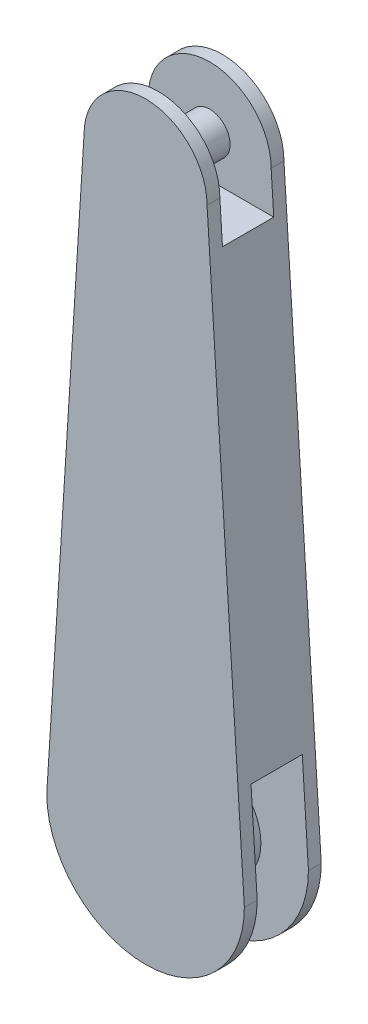
ISO-10303-21;
HEADER;
FILE_DESCRIPTION(('STEP AP214'),'2;1');
FILE_NAME('part.step','',(''),(''),'','','');
FILE_SCHEMA(('AUTOMOTIVE_DESIGN { 1 0 10303 214 1 1 1 1 }'));
ENDSEC;
DATA;
#1=APPLICATION_CONTEXT('core data for automotive mechanical design processes');
#2=APPLICATION_PROTOCOL_DEFINITION('international standard','automotive_design',2000,#1);
#3=PRODUCT_CONTEXT('',#1,'mechanical');
#4=PRODUCT('Part','Part','',(#3));
#5=PRODUCT_RELATED_PRODUCT_CATEGORY('part','',(#4));
#6=PRODUCT_DEFINITION_FORMATION('','',#4);
#7=PRODUCT_DEFINITION_CONTEXT('part definition',#1,'design');
#8=PRODUCT_DEFINITION('design','',#6,#7);
#9=PRODUCT_DEFINITION_SHAPE('','',#8);
#10=(LENGTH_UNIT() NAMED_UNIT(*) SI_UNIT(.MILLI.,.METRE.));
#11=(NAMED_UNIT(*) PLANE_ANGLE_UNIT() SI_UNIT($,.RADIAN.));
#12=(NAMED_UNIT(*) SI_UNIT($,.STERADIAN.) SOLID_ANGLE_UNIT());
#13=UNCERTAINTY_MEASURE_WITH_UNIT(LENGTH_MEASURE(1.E-05),#10,'distance_accuracy_value','');
#14=(GEOMETRIC_REPRESENTATION_CONTEXT(3) GLOBAL_UNCERTAINTY_ASSIGNED_CONTEXT((#13)) GLOBAL_UNIT_ASSIGNED_CONTEXT((#10,
#11,#12)) REPRESENTATION_CONTEXT('',''));
#15=CARTESIAN_POINT('',(0.,0.,0.));
#16=DIRECTION('',(0.,0.,1.));
#17=DIRECTION('',(1.,0.,0.));
#18=AXIS2_PLACEMENT_3D('',#15,#16,#17);
#19=CARTESIAN_POINT('',(0.,1342.75,75.));
#20=DIRECTION('',(0.,0.,-1.));
#21=DIRECTION('',(-1.,0.,0.));
#22=AXIS2_PLACEMENT_3D('',#19,#20,#21);
#23=CYLINDRICAL_SURFACE('',#22,120.);
#24=DIRECTION('',(0.,0.,-1.));
#25=VECTOR('',#24,1.);
#26=CARTESIAN_POINT('',(120.,1342.75,75.));
#27=LINE('',#26,#25);
#28=CARTESIAN_POINT('',(120.,1342.75,75.));
#29=VERTEX_POINT('',#28);
#30=CARTESIAN_POINT('',(120.,1342.75,50.));
#31=VERTEX_POINT('',#30);
#32=EDGE_CURVE('E191',#29,#31,#27,.T.);
#33=ORIENTED_EDGE('',*,*,#32,.T.);
#34=CARTESIAN_POINT('',(0.,1342.75,50.));
#35=DIRECTION('',(0.,0.,1.));
#36=DIRECTION('',(1.,0.,0.));
#37=AXIS2_PLACEMENT_3D('',#34,#35,#36);
#38=CIRCLE('',#37,120.);
#39=CARTESIAN_POINT('',(-120.,1342.75,50.));
#40=VERTEX_POINT('',#39);
#41=EDGE_CURVE('E59',#31,#40,#38,.T.);
#42=ORIENTED_EDGE('',*,*,#41,.T.);
#43=DIRECTION('',(0.,0.,-1.));
#44=VECTOR('',#43,1.);
#45=CARTESIAN_POINT('',(-120.,1342.75,75.));
#46=LINE('',#45,#44);
#47=CARTESIAN_POINT('',(-120.,1342.75,75.));
#48=VERTEX_POINT('',#47);
#49=EDGE_CURVE('E146',#48,#40,#46,.T.);
#50=ORIENTED_EDGE('',*,*,#49,.F.);
#51=CARTESIAN_POINT('',(0.,1342.75,75.));
#52=DIRECTION('',(0.,0.,1.));
#53=DIRECTION('',(1.,0.,0.));
#54=AXIS2_PLACEMENT_3D('',#51,#52,#53);
#55=CIRCLE('',#54,120.);
#56=EDGE_CURVE('E169',#29,#48,#55,.T.);
#57=ORIENTED_EDGE('',*,*,#56,.F.);
#58=EDGE_LOOP('',(#33,#42,#50,#57));
#59=FACE_BOUND('',#58,.T.);
#60=ADVANCED_FACE('F36',(#59),#23,.T.);
#61=CARTESIAN_POINT('',(0.,192.75,75.));
#62=DIRECTION('',(0.,0.,-1.));
#63=DIRECTION('',(-1.,0.,0.));
#64=AXIS2_PLACEMENT_3D('',#61,#62,#63);
#65=CYLINDRICAL_SURFACE('',#64,192.75);
#66=DIRECTION('',(0.,0.,-1.));
#67=VECTOR('',#66,1.);
#68=CARTESIAN_POINT('',(192.75,192.75,75.));
#69=LINE('',#68,#67);
#70=CARTESIAN_POINT('',(192.75,192.75,-50.));
#71=VERTEX_POINT('',#70);
#72=CARTESIAN_POINT('',(192.75,192.75,-75.));
#73=VERTEX_POINT('',#72);
#74=EDGE_CURVE('E194',#71,#73,#69,.T.);
#75=ORIENTED_EDGE('',*,*,#74,.F.);
#76=CARTESIAN_POINT('',(0.,192.75,-50.));
#77=DIRECTION('',(0.,0.,-1.));
#78=DIRECTION('',(-1.,0.,0.));
#79=AXIS2_PLACEMENT_3D('',#76,#77,#78);
#80=CIRCLE('',#79,192.75);
#81=CARTESIAN_POINT('',(-192.75,192.75,-50.));
#82=VERTEX_POINT('',#81);
#83=EDGE_CURVE('E162',#71,#82,#80,.T.);
#84=ORIENTED_EDGE('',*,*,#83,.T.);
#85=DIRECTION('',(0.,0.,-1.));
#86=VECTOR('',#85,1.);
#87=CARTESIAN_POINT('',(-192.75,192.75,75.));
#88=LINE('',#87,#86);
#89=CARTESIAN_POINT('',(-192.75,192.75,-75.));
#90=VERTEX_POINT('',#89);
#91=EDGE_CURVE('E198',#82,#90,#88,.T.);
#92=ORIENTED_EDGE('',*,*,#91,.T.);
#93=CARTESIAN_POINT('',(0.,192.75,-75.));
#94=DIRECTION('',(0.,0.,1.));
#95=DIRECTION('',(1.,0.,0.));
#96=AXIS2_PLACEMENT_3D('',#93,#94,#95);
#97=CIRCLE('',#96,192.75);
#98=EDGE_CURVE('E186',#90,#73,#97,.T.);
#99=ORIENTED_EDGE('',*,*,#98,.T.);
#100=EDGE_LOOP('',(#75,#84,#92,#99));
#101=FACE_BOUND('',#100,.T.);
#102=ADVANCED_FACE('F264',(#101),#65,.T.);
#103=CARTESIAN_POINT('',(0.,1342.75,-50.));
#104=DIRECTION('',(0.,0.,-1.));
#105=DIRECTION('',(-1.,0.,0.));
#106=AXIS2_PLACEMENT_3D('',#103,#104,#105);
#107=CIRCLE('',#106,120.);
#108=CARTESIAN_POINT('',(-120.,1342.75,-50.));
#109=VERTEX_POINT('',#108);
#110=CARTESIAN_POINT('',(120.,1342.75,-50.));
#111=VERTEX_POINT('',#110);
#112=EDGE_CURVE('E136',#109,#111,#107,.T.);
#113=ORIENTED_EDGE('',*,*,#112,.T.);
#114=CARTESIAN_POINT('',(120.,1342.75,-75.));
#115=VERTEX_POINT('',#114);
#116=EDGE_CURVE('E180',#111,#115,#27,.T.);
#117=ORIENTED_EDGE('',*,*,#116,.T.);
#118=CARTESIAN_POINT('',(0.,1342.75,-75.));
#119=DIRECTION('',(0.,0.,1.));
#120=DIRECTION('',(1.,0.,0.));
#121=AXIS2_PLACEMENT_3D('',#118,#119,#120);
#122=CIRCLE('',#121,120.);
#123=CARTESIAN_POINT('',(-120.,1342.75,-75.));
#124=VERTEX_POINT('',#123);
#125=EDGE_CURVE('E168',#115,#124,#122,.T.);
#126=ORIENTED_EDGE('',*,*,#125,.T.);
#127=EDGE_CURVE('E202',#109,#124,#46,.T.);
#128=ORIENTED_EDGE('',*,*,#127,.F.);
#129=EDGE_LOOP('',(#113,#117,#126,#128));
#130=FACE_BOUND('',#129,.T.);
#131=ADVANCED_FACE('F38',(#130),#23,.T.);
#132=CARTESIAN_POINT('',(-120.,1342.75,75.));
#133=DIRECTION('',(0.998005017045994,-0.0631346652087794,0.));
#134=DIRECTION('',(0.0631346652087794,0.998005017045994,0.));
#135=AXIS2_PLACEMENT_3D('',#132,#133,#134);
#136=PLANE('',#135);
#137=ORIENTED_EDGE('',*,*,#91,.F.);
#138=DIRECTION('',(0.0631346652087794,0.998005017045994,0.));
#139=VECTOR('',#138,1.);
#140=CARTESIAN_POINT('',(-120.,1342.75,-50.));
#141=LINE('',#140,#139);
#142=CARTESIAN_POINT('',(-180.730434782609,382.75,-50.));
#143=VERTEX_POINT('',#142);
#144=EDGE_CURVE('E165',#82,#143,#141,.T.);
#145=ORIENTED_EDGE('',*,*,#144,.T.);
#146=DIRECTION('',(0.,0.,1.));
#147=VECTOR('',#146,1.);
#148=CARTESIAN_POINT('',(-180.730434782609,382.75,75.));
#149=LINE('',#148,#147);
#150=CARTESIAN_POINT('',(-180.730434782609,382.75,50.));
#151=VERTEX_POINT('',#150);
#152=EDGE_CURVE('E154',#143,#151,#149,.T.);
#153=ORIENTED_EDGE('',*,*,#152,.T.);
#154=DIRECTION('',(-0.0631346652087794,-0.998005017045994,0.));
#155=VECTOR('',#154,1.);
#156=CARTESIAN_POINT('',(-120.,1342.75,50.));
#157=LINE('',#156,#155);
#158=CARTESIAN_POINT('',(-192.75,192.75,50.));
#159=VERTEX_POINT('',#158);
#160=EDGE_CURVE('E159',#151,#159,#157,.T.);
#161=ORIENTED_EDGE('',*,*,#160,.T.);
#162=CARTESIAN_POINT('',(-192.75,192.75,75.));
#163=VERTEX_POINT('',#162);
#164=EDGE_CURVE('E199',#163,#159,#88,.T.);
#165=ORIENTED_EDGE('',*,*,#164,.F.);
#166=DIRECTION('',(-0.0631346652087794,-0.998005017045994,0.));
#167=VECTOR('',#166,1.);
#168=CARTESIAN_POINT('',(-120.,1342.75,75.));
#169=LINE('',#168,#167);
#170=EDGE_CURVE('E172',#48,#163,#169,.T.);
#171=ORIENTED_EDGE('',*,*,#170,.F.);
#172=ORIENTED_EDGE('',*,*,#49,.T.);
#173=DIRECTION('',(-0.0631346652087794,-0.998005017045994,0.));
#174=VECTOR('',#173,1.);
#175=CARTESIAN_POINT('',(-120.,1342.75,50.));
#176=LINE('',#175,#174);
#177=CARTESIAN_POINT('',(-125.060869565217,1262.75,50.));
#178=VERTEX_POINT('',#177);
#179=EDGE_CURVE('E137',#40,#178,#176,.T.);
#180=ORIENTED_EDGE('',*,*,#179,.T.);
#181=DIRECTION('',(0.,0.,-1.));
#182=VECTOR('',#181,1.);
#183=CARTESIAN_POINT('',(-125.060869565217,1262.75,75.));
#184=LINE('',#183,#182);
#185=CARTESIAN_POINT('',(-125.060869565217,1262.75,-50.));
#186=VERTEX_POINT('',#185);
#187=EDGE_CURVE('E126',#178,#186,#184,.T.);
#188=ORIENTED_EDGE('',*,*,#187,.T.);
#189=DIRECTION('',(0.0631346652087794,0.998005017045994,0.));
#190=VECTOR('',#189,1.);
#191=CARTESIAN_POINT('',(-120.,1342.75,-50.));
#192=LINE('',#191,#190);
#193=EDGE_CURVE('E152',#186,#109,#192,.T.);
#194=ORIENTED_EDGE('',*,*,#193,.T.);
#195=ORIENTED_EDGE('',*,*,#127,.T.);
#196=DIRECTION('',(-0.0631346652087794,-0.998005017045994,0.));
#197=VECTOR('',#196,1.);
#198=CARTESIAN_POINT('',(-120.,1342.75,-75.));
#199=LINE('',#198,#197);
#200=EDGE_CURVE('E183',#124,#90,#199,.T.);
#201=ORIENTED_EDGE('',*,*,#200,.T.);
#202=EDGE_LOOP('',(#137,#145,#153,#161,#165,#171,#172,#180,#188,#194,#195,#201));
#203=FACE_BOUND('',#202,.T.);
#204=ADVANCED_FACE('F144',(#203),#136,.F.);
#205=ORIENTED_EDGE('',*,*,#164,.T.);
#206=CARTESIAN_POINT('',(0.,192.75,50.));
#207=DIRECTION('',(0.,0.,1.));
#208=DIRECTION('',(1.,0.,0.));
#209=AXIS2_PLACEMENT_3D('',#206,#207,#208);
#210=CIRCLE('',#209,192.75);
#211=CARTESIAN_POINT('',(192.75,192.75,50.));
#212=VERTEX_POINT('',#211);
#213=EDGE_CURVE('E157',#159,#212,#210,.T.);
#214=ORIENTED_EDGE('',*,*,#213,.T.);
#215=CARTESIAN_POINT('',(192.75,192.75,75.));
#216=VERTEX_POINT('',#215);
#217=EDGE_CURVE('E195',#216,#212,#69,.T.);
#218=ORIENTED_EDGE('',*,*,#217,.F.);
#219=CARTESIAN_POINT('',(0.,192.75,75.));
#220=DIRECTION('',(0.,0.,1.));
#221=DIRECTION('',(1.,0.,0.));
#222=AXIS2_PLACEMENT_3D('',#219,#220,#221);
#223=CIRCLE('',#222,192.75);
#224=EDGE_CURVE('E175',#163,#216,#223,.T.);
#225=ORIENTED_EDGE('',*,*,#224,.F.);
#226=EDGE_LOOP('',(#205,#214,#218,#225));
#227=FACE_BOUND('',#226,.T.);
#228=ADVANCED_FACE('F245',(#227),#65,.T.);
#229=CARTESIAN_POINT('',(120.,1342.75,75.));
#230=DIRECTION('',(0.998005017045994,0.0631346652087794,0.));
#231=DIRECTION('',(-0.0631346652087794,0.998005017045994,0.));
#232=AXIS2_PLACEMENT_3D('',#229,#230,#231);
#233=PLANE('',#232);
#234=DIRECTION('',(-0.0631346652087794,0.998005017045994,0.));
#235=VECTOR('',#234,1.);
#236=CARTESIAN_POINT('',(120.,1342.75,-50.));
#237=LINE('',#236,#235);
#238=CARTESIAN_POINT('',(180.730434782609,382.75,-50.));
#239=VERTEX_POINT('',#238);
#240=EDGE_CURVE('E215',#71,#239,#237,.T.);
#241=ORIENTED_EDGE('',*,*,#240,.F.);
#242=ORIENTED_EDGE('',*,*,#74,.T.);
#243=DIRECTION('',(0.0631346652087794,-0.998005017045994,0.));
#244=VECTOR('',#243,1.);
#245=CARTESIAN_POINT('',(120.,1342.75,-75.));
#246=LINE('',#245,#244);
#247=EDGE_CURVE('E173',#115,#73,#246,.T.);
#248=ORIENTED_EDGE('',*,*,#247,.F.);
#249=ORIENTED_EDGE('',*,*,#116,.F.);
#250=DIRECTION('',(-0.0631346652087794,0.998005017045994,0.));
#251=VECTOR('',#250,1.);
#252=CARTESIAN_POINT('',(120.,1342.75,-50.));
#253=LINE('',#252,#251);
#254=CARTESIAN_POINT('',(125.060869565217,1262.75,-50.));
#255=VERTEX_POINT('',#254);
#256=EDGE_CURVE('E207',#255,#111,#253,.T.);
#257=ORIENTED_EDGE('',*,*,#256,.F.);
#258=DIRECTION('',(0.,0.,-1.));
#259=VECTOR('',#258,1.);
#260=CARTESIAN_POINT('',(125.060869565217,1262.75,75.));
#261=LINE('',#260,#259);
#262=CARTESIAN_POINT('',(125.060869565217,1262.75,50.));
#263=VERTEX_POINT('',#262);
#264=EDGE_CURVE('E205',#263,#255,#261,.T.);
#265=ORIENTED_EDGE('',*,*,#264,.F.);
#266=DIRECTION('',(0.0631346652087794,-0.998005017045994,0.));
#267=VECTOR('',#266,1.);
#268=CARTESIAN_POINT('',(120.,1342.75,50.));
#269=LINE('',#268,#267);
#270=EDGE_CURVE('E140',#31,#263,#269,.T.);
#271=ORIENTED_EDGE('',*,*,#270,.F.);
#272=ORIENTED_EDGE('',*,*,#32,.F.);
#273=DIRECTION('',(0.0631346652087794,-0.998005017045994,0.));
#274=VECTOR('',#273,1.);
#275=CARTESIAN_POINT('',(120.,1342.75,75.));
#276=LINE('',#275,#274);
#277=EDGE_CURVE('E177',#29,#216,#276,.T.);
#278=ORIENTED_EDGE('',*,*,#277,.T.);
#279=ORIENTED_EDGE('',*,*,#217,.T.);
#280=DIRECTION('',(0.0631346652087794,-0.998005017045994,0.));
#281=VECTOR('',#280,1.);
#282=CARTESIAN_POINT('',(120.,1342.75,50.));
#283=LINE('',#282,#281);
#284=CARTESIAN_POINT('',(180.730434782609,382.75,50.));
#285=VERTEX_POINT('',#284);
#286=EDGE_CURVE('E212',#285,#212,#283,.T.);
#287=ORIENTED_EDGE('',*,*,#286,.F.);
#288=DIRECTION('',(0.,0.,1.));
#289=VECTOR('',#288,1.);
#290=CARTESIAN_POINT('',(180.730434782609,382.75,75.));
#291=LINE('',#290,#289);
#292=EDGE_CURVE('E210',#239,#285,#291,.T.);
#293=ORIENTED_EDGE('',*,*,#292,.F.);
#294=EDGE_LOOP('',(#241,#242,#248,#249,#257,#265,#271,#272,#278,#279,#287,#293));
#295=FACE_BOUND('',#294,.T.);
#296=ADVANCED_FACE('F240',(#295),#233,.T.);
#297=CARTESIAN_POINT('',(0.,1342.75,75.));
#298=DIRECTION('',(0.,0.,1.));
#299=DIRECTION('',(1.,0.,0.));
#300=AXIS2_PLACEMENT_3D('',#297,#298,#299);
#301=PLANE('',#300);
#302=ORIENTED_EDGE('',*,*,#56,.T.);
#303=ORIENTED_EDGE('',*,*,#170,.T.);
#304=ORIENTED_EDGE('',*,*,#224,.T.);
#305=ORIENTED_EDGE('',*,*,#277,.F.);
#306=EDGE_LOOP('',(#302,#303,#304,#305));
#307=FACE_BOUND('',#306,.T.);
#308=ADVANCED_FACE('F278',(#307),#301,.T.);
#309=CARTESIAN_POINT('',(0.,1342.75,-75.));
#310=DIRECTION('',(0.,0.,1.));
#311=DIRECTION('',(1.,0.,0.));
#312=AXIS2_PLACEMENT_3D('',#309,#310,#311);
#313=PLANE('',#312);
#314=ORIENTED_EDGE('',*,*,#125,.F.);
#315=ORIENTED_EDGE('',*,*,#247,.T.);
#316=ORIENTED_EDGE('',*,*,#98,.F.);
#317=ORIENTED_EDGE('',*,*,#200,.F.);
#318=EDGE_LOOP('',(#314,#315,#316,#317));
#319=FACE_BOUND('',#318,.T.);
#320=ADVANCED_FACE('F260',(#319),#313,.F.);
#321=CARTESIAN_POINT('',(-195.,1462.75,-50.));
#322=DIRECTION('',(0.,0.,-1.));
#323=DIRECTION('',(-1.,0.,0.));
#324=AXIS2_PLACEMENT_3D('',#321,#322,#323);
#325=PLANE('',#324);
#326=CARTESIAN_POINT('',(0.,1342.75,-50.));
#327=DIRECTION('',(0.,0.,-1.));
#328=DIRECTION('',(-1.,0.,0.));
#329=AXIS2_PLACEMENT_3D('',#326,#327,#328);
#330=CIRCLE('',#329,40.);
#331=CARTESIAN_POINT('',(-40.,1342.75,-50.));
#332=VERTEX_POINT('',#331);
#333=EDGE_CURVE('E220',#332,#332,#330,.F.);
#334=ORIENTED_EDGE('',*,*,#333,.F.);
#335=EDGE_LOOP('',(#334));
#336=FACE_BOUND('',#335,.T.);
#337=DIRECTION('',(1.,0.,0.));
#338=VECTOR('',#337,1.);
#339=CARTESIAN_POINT('',(-195.,1262.75,-50.));
#340=LINE('',#339,#338);
#341=EDGE_CURVE('E132',#186,#255,#340,.T.);
#342=ORIENTED_EDGE('',*,*,#341,.T.);
#343=ORIENTED_EDGE('',*,*,#256,.T.);
#344=ORIENTED_EDGE('',*,*,#112,.F.);
#345=ORIENTED_EDGE('',*,*,#193,.F.);
#346=EDGE_LOOP('',(#342,#343,#344,#345));
#347=FACE_BOUND('',#346,.T.);
#348=ADVANCED_FACE('F252',(#336,#347),#325,.F.);
#349=CARTESIAN_POINT('',(-195.,1262.75,-50.));
#350=DIRECTION('',(0.,-1.,0.));
#351=DIRECTION('',(0.,0.,-1.));
#352=AXIS2_PLACEMENT_3D('',#349,#350,#351);
#353=PLANE('',#352);
#354=DIRECTION('',(1.,0.,0.));
#355=VECTOR('',#354,1.);
#356=CARTESIAN_POINT('',(-195.,1262.75,50.));
#357=LINE('',#356,#355);
#358=EDGE_CURVE('E129',#178,#263,#357,.T.);
#359=ORIENTED_EDGE('',*,*,#358,.T.);
#360=ORIENTED_EDGE('',*,*,#264,.T.);
#361=ORIENTED_EDGE('',*,*,#341,.F.);
#362=ORIENTED_EDGE('',*,*,#187,.F.);
#363=EDGE_LOOP('',(#359,#360,#361,#362));
#364=FACE_BOUND('',#363,.T.);
#365=ADVANCED_FACE('F128',(#364),#353,.F.);
#366=CARTESIAN_POINT('',(-195.,1462.75,50.));
#367=DIRECTION('',(0.,0.,1.));
#368=DIRECTION('',(1.,0.,0.));
#369=AXIS2_PLACEMENT_3D('',#366,#367,#368);
#370=PLANE('',#369);
#371=CARTESIAN_POINT('',(0.,1342.75,50.));
#372=DIRECTION('',(0.,0.,1.));
#373=DIRECTION('',(1.,0.,0.));
#374=AXIS2_PLACEMENT_3D('',#371,#372,#373);
#375=CIRCLE('',#374,40.);
#376=CARTESIAN_POINT('',(40.,1342.75,50.));
#377=VERTEX_POINT('',#376);
#378=EDGE_CURVE('E217',#377,#377,#375,.F.);
#379=ORIENTED_EDGE('',*,*,#378,.F.);
#380=EDGE_LOOP('',(#379));
#381=FACE_BOUND('',#380,.T.);
#382=ORIENTED_EDGE('',*,*,#41,.F.);
#383=ORIENTED_EDGE('',*,*,#270,.T.);
#384=ORIENTED_EDGE('',*,*,#358,.F.);
#385=ORIENTED_EDGE('',*,*,#179,.F.);
#386=EDGE_LOOP('',(#382,#383,#384,#385));
#387=FACE_BOUND('',#386,.T.);
#388=ADVANCED_FACE('F139',(#381,#387),#370,.F.);
#389=CARTESIAN_POINT('',(-195.,0.,-50.));
#390=DIRECTION('',(0.,0.,-1.));
#391=DIRECTION('',(-1.,0.,0.));
#392=AXIS2_PLACEMENT_3D('',#389,#390,#391);
#393=PLANE('',#392);
#394=CARTESIAN_POINT('',(0.,192.75,-50.));
#395=DIRECTION('',(0.,0.,-1.));
#396=DIRECTION('',(-1.,0.,0.));
#397=AXIS2_PLACEMENT_3D('',#394,#395,#396);
#398=CIRCLE('',#397,100.);
#399=CARTESIAN_POINT('',(-100.,192.75,-50.));
#400=VERTEX_POINT('',#399);
#401=EDGE_CURVE('E11',#400,#400,#398,.F.);
#402=ORIENTED_EDGE('',*,*,#401,.F.);
#403=EDGE_LOOP('',(#402));
#404=FACE_BOUND('',#403,.T.);
#405=ORIENTED_EDGE('',*,*,#83,.F.);
#406=ORIENTED_EDGE('',*,*,#240,.T.);
#407=DIRECTION('',(1.,0.,0.));
#408=VECTOR('',#407,1.);
#409=CARTESIAN_POINT('',(-195.,382.75,-50.));
#410=LINE('',#409,#408);
#411=EDGE_CURVE('E51',#143,#239,#410,.T.);
#412=ORIENTED_EDGE('',*,*,#411,.F.);
#413=ORIENTED_EDGE('',*,*,#144,.F.);
#414=EDGE_LOOP('',(#405,#406,#412,#413));
#415=FACE_BOUND('',#414,.T.);
#416=ADVANCED_FACE('F231',(#404,#415),#393,.F.);
#417=CARTESIAN_POINT('',(-195.,0.,50.));
#418=DIRECTION('',(0.,0.,1.));
#419=DIRECTION('',(1.,0.,0.));
#420=AXIS2_PLACEMENT_3D('',#417,#418,#419);
#421=PLANE('',#420);
#422=CARTESIAN_POINT('',(0.,192.75,50.));
#423=DIRECTION('',(0.,0.,1.));
#424=DIRECTION('',(1.,0.,0.));
#425=AXIS2_PLACEMENT_3D('',#422,#423,#424);
#426=CIRCLE('',#425,100.);
#427=CARTESIAN_POINT('',(100.,192.75,50.));
#428=VERTEX_POINT('',#427);
#429=EDGE_CURVE('E44',#428,#428,#426,.F.);
#430=ORIENTED_EDGE('',*,*,#429,.F.);
#431=EDGE_LOOP('',(#430));
#432=FACE_BOUND('',#431,.T.);
#433=DIRECTION('',(1.,0.,0.));
#434=VECTOR('',#433,1.);
#435=CARTESIAN_POINT('',(-195.,382.75,50.));
#436=LINE('',#435,#434);
#437=EDGE_CURVE('E148',#151,#285,#436,.T.);
#438=ORIENTED_EDGE('',*,*,#437,.T.);
#439=ORIENTED_EDGE('',*,*,#286,.T.);
#440=ORIENTED_EDGE('',*,*,#213,.F.);
#441=ORIENTED_EDGE('',*,*,#160,.F.);
#442=EDGE_LOOP('',(#438,#439,#440,#441));
#443=FACE_BOUND('',#442,.T.);
#444=ADVANCED_FACE('F227',(#432,#443),#421,.F.);
#445=CARTESIAN_POINT('',(-195.,382.75,-50.));
#446=DIRECTION('',(0.,1.,0.));
#447=DIRECTION('',(0.,0.,1.));
#448=AXIS2_PLACEMENT_3D('',#445,#446,#447);
#449=PLANE('',#448);
#450=ORIENTED_EDGE('',*,*,#411,.T.);
#451=ORIENTED_EDGE('',*,*,#292,.T.);
#452=ORIENTED_EDGE('',*,*,#437,.F.);
#453=ORIENTED_EDGE('',*,*,#152,.F.);
#454=EDGE_LOOP('',(#450,#451,#452,#453));
#455=FACE_BOUND('',#454,.T.);
#456=ADVANCED_FACE('F230',(#455),#449,.F.);
#457=CARTESIAN_POINT('',(0.,1342.75,-50.));
#458=DIRECTION('',(0.,0.,1.));
#459=DIRECTION('',(1.,0.,0.));
#460=AXIS2_PLACEMENT_3D('',#457,#458,#459);
#461=CYLINDRICAL_SURFACE('',#460,40.);
#462=ORIENTED_EDGE('',*,*,#333,.T.);
#463=EDGE_LOOP('',(#462));
#464=FACE_BOUND('',#463,.T.);
#465=ORIENTED_EDGE('',*,*,#378,.T.);
#466=EDGE_LOOP('',(#465));
#467=FACE_BOUND('',#466,.T.);
#468=ADVANCED_FACE('F341',(#464,#467),#461,.T.);
#469=CARTESIAN_POINT('',(0.,192.75,-50.));
#470=DIRECTION('',(0.,0.,1.));
#471=DIRECTION('',(1.,0.,0.));
#472=AXIS2_PLACEMENT_3D('',#469,#470,#471);
#473=CYLINDRICAL_SURFACE('',#472,100.);
#474=ORIENTED_EDGE('',*,*,#401,.T.);
#475=EDGE_LOOP('',(#474));
#476=FACE_BOUND('',#475,.T.);
#477=ORIENTED_EDGE('',*,*,#429,.T.);
#478=EDGE_LOOP('',(#477));
#479=FACE_BOUND('',#478,.T.);
#480=ADVANCED_FACE('F225',(#476,#479),#473,.T.);
#481=CLOSED_SHELL('',(#60,#102,#131,#204,#228,#296,#308,#320,#348,#365,#388,#416,#444,#456,#468,#480));
#482=MANIFOLD_SOLID_BREP('B2',#481);
#483=ADVANCED_BREP_SHAPE_REPRESENTATION('',(#18,#482),#14);
#484=SHAPE_DEFINITION_REPRESENTATION(#9,#483);
ENDSEC;
END-ISO-10303-21;
